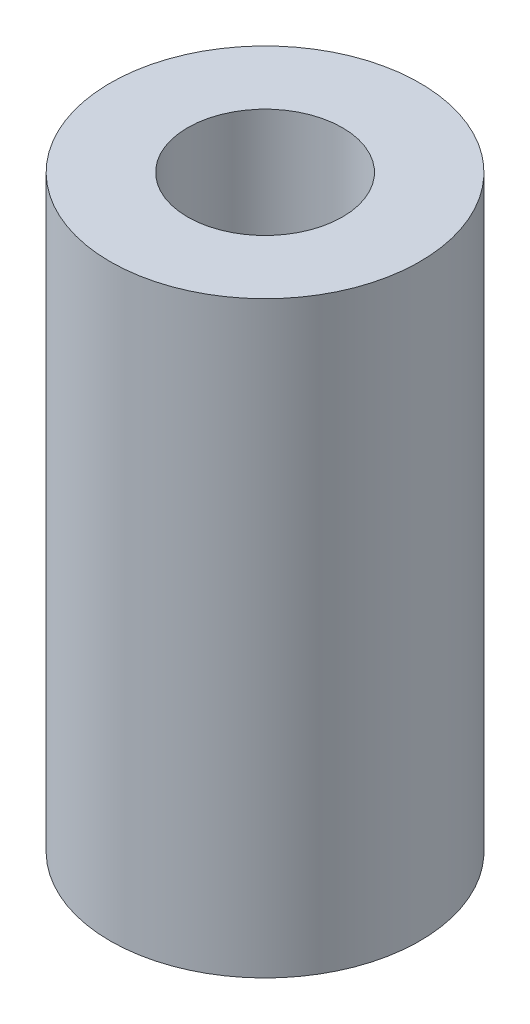
ISO-10303-21;
HEADER;
FILE_DESCRIPTION(('STEP AP214'),'2;1');
FILE_NAME('part.step','',(''),(''),'','','');
FILE_SCHEMA(('AUTOMOTIVE_DESIGN { 1 0 10303 214 1 1 1 1 }'));
ENDSEC;
DATA;
#1=APPLICATION_CONTEXT('core data for automotive mechanical design processes');
#2=APPLICATION_PROTOCOL_DEFINITION('international standard','automotive_design',2000,#1);
#3=PRODUCT_CONTEXT('',#1,'mechanical');
#4=PRODUCT('Part','Part','',(#3));
#5=PRODUCT_RELATED_PRODUCT_CATEGORY('part','',(#4));
#6=PRODUCT_DEFINITION_FORMATION('','',#4);
#7=PRODUCT_DEFINITION_CONTEXT('part definition',#1,'design');
#8=PRODUCT_DEFINITION('design','',#6,#7);
#9=PRODUCT_DEFINITION_SHAPE('','',#8);
#10=(LENGTH_UNIT() NAMED_UNIT(*) SI_UNIT(.MILLI.,.METRE.));
#11=(NAMED_UNIT(*) PLANE_ANGLE_UNIT() SI_UNIT($,.RADIAN.));
#12=(NAMED_UNIT(*) SI_UNIT($,.STERADIAN.) SOLID_ANGLE_UNIT());
#13=UNCERTAINTY_MEASURE_WITH_UNIT(LENGTH_MEASURE(1.E-05),#10,'distance_accuracy_value','');
#14=(GEOMETRIC_REPRESENTATION_CONTEXT(3) GLOBAL_UNCERTAINTY_ASSIGNED_CONTEXT((#13)) GLOBAL_UNIT_ASSIGNED_CONTEXT((#10,
#11,#12)) REPRESENTATION_CONTEXT('',''));
#15=CARTESIAN_POINT('',(0.,0.,0.));
#16=DIRECTION('',(0.,0.,1.));
#17=DIRECTION('',(1.,0.,0.));
#18=AXIS2_PLACEMENT_3D('',#15,#16,#17);
#19=CARTESIAN_POINT('',(0.,19.,0.));
#20=DIRECTION('',(0.,1.,0.));
#21=DIRECTION('',(0.,0.,1.));
#22=AXIS2_PLACEMENT_3D('',#19,#20,#21);
#23=PLANE('',#22);
#24=CARTESIAN_POINT('',(0.,19.,0.));
#25=DIRECTION('',(0.,1.,0.));
#26=DIRECTION('',(0.,0.,1.));
#27=AXIS2_PLACEMENT_3D('',#24,#25,#26);
#28=CIRCLE('',#27,5.);
#29=CARTESIAN_POINT('',(0.,19.,5.));
#30=VERTEX_POINT('',#29);
#31=EDGE_CURVE('E10',#30,#30,#28,.T.);
#32=ORIENTED_EDGE('',*,*,#31,.T.);
#33=EDGE_LOOP('',(#32));
#34=FACE_BOUND('',#33,.T.);
#35=CARTESIAN_POINT('',(0.,19.,0.));
#36=DIRECTION('',(0.,1.,0.));
#37=DIRECTION('',(0.,0.,1.));
#38=AXIS2_PLACEMENT_3D('',#35,#36,#37);
#39=CIRCLE('',#38,2.5);
#40=CARTESIAN_POINT('',(0.,19.,2.5));
#41=VERTEX_POINT('',#40);
#42=EDGE_CURVE('E47',#41,#41,#39,.T.);
#43=ORIENTED_EDGE('',*,*,#42,.F.);
#44=EDGE_LOOP('',(#43));
#45=FACE_BOUND('',#44,.T.);
#46=ADVANCED_FACE('F36',(#34,#45),#23,.T.);
#47=CARTESIAN_POINT('',(0.,0.,0.));
#48=DIRECTION('',(0.,1.,0.));
#49=DIRECTION('',(0.,0.,1.));
#50=AXIS2_PLACEMENT_3D('',#47,#48,#49);
#51=PLANE('',#50);
#52=CARTESIAN_POINT('',(0.,0.,0.));
#53=DIRECTION('',(0.,1.,0.));
#54=DIRECTION('',(0.,0.,1.));
#55=AXIS2_PLACEMENT_3D('',#52,#53,#54);
#56=CIRCLE('',#55,5.);
#57=CARTESIAN_POINT('',(0.,0.,5.));
#58=VERTEX_POINT('',#57);
#59=EDGE_CURVE('E40',#58,#58,#56,.T.);
#60=ORIENTED_EDGE('',*,*,#59,.F.);
#61=EDGE_LOOP('',(#60));
#62=FACE_BOUND('',#61,.T.);
#63=CARTESIAN_POINT('',(0.,0.,0.));
#64=DIRECTION('',(0.,1.,0.));
#65=DIRECTION('',(0.,0.,1.));
#66=AXIS2_PLACEMENT_3D('',#63,#64,#65);
#67=CIRCLE('',#66,2.5);
#68=CARTESIAN_POINT('',(0.,0.,2.5));
#69=VERTEX_POINT('',#68);
#70=EDGE_CURVE('E49',#69,#69,#67,.T.);
#71=ORIENTED_EDGE('',*,*,#70,.T.);
#72=EDGE_LOOP('',(#71));
#73=FACE_BOUND('',#72,.T.);
#74=ADVANCED_FACE('F59',(#62,#73),#51,.F.);
#75=CARTESIAN_POINT('',(0.,19.,0.));
#76=DIRECTION('',(0.,-1.,0.));
#77=DIRECTION('',(0.,0.,-1.));
#78=AXIS2_PLACEMENT_3D('',#75,#76,#77);
#79=CYLINDRICAL_SURFACE('',#78,5.);
#80=ORIENTED_EDGE('',*,*,#31,.F.);
#81=EDGE_LOOP('',(#80));
#82=FACE_BOUND('',#81,.T.);
#83=ORIENTED_EDGE('',*,*,#59,.T.);
#84=EDGE_LOOP('',(#83));
#85=FACE_BOUND('',#84,.T.);
#86=ADVANCED_FACE('F38',(#82,#85),#79,.T.);
#87=CARTESIAN_POINT('',(0.,19.,0.));
#88=DIRECTION('',(0.,-1.,0.));
#89=DIRECTION('',(0.,0.,-1.));
#90=AXIS2_PLACEMENT_3D('',#87,#88,#89);
#91=CYLINDRICAL_SURFACE('',#90,2.5);
#92=ORIENTED_EDGE('',*,*,#42,.T.);
#93=EDGE_LOOP('',(#92));
#94=FACE_BOUND('',#93,.T.);
#95=ORIENTED_EDGE('',*,*,#70,.F.);
#96=EDGE_LOOP('',(#95));
#97=FACE_BOUND('',#96,.T.);
#98=ADVANCED_FACE('F55',(#94,#97),#91,.F.);
#99=CLOSED_SHELL('',(#46,#74,#86,#98));
#100=MANIFOLD_SOLID_BREP('B2',#99);
#101=ADVANCED_BREP_SHAPE_REPRESENTATION('',(#18,#100),#14);
#102=SHAPE_DEFINITION_REPRESENTATION(#9,#101);
ENDSEC;
END-ISO-10303-21;
